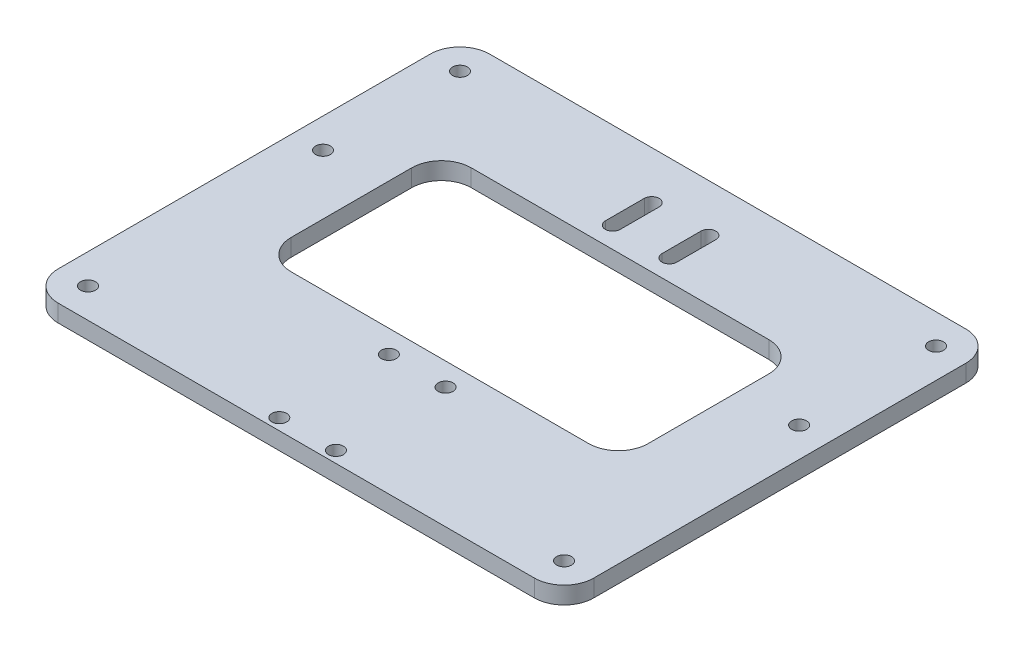
ISO-10303-21;
HEADER;
FILE_DESCRIPTION(('STEP AP214'),'2;1');
FILE_NAME('part.step','',(''),(''),'','','');
FILE_SCHEMA(('AUTOMOTIVE_DESIGN { 1 0 10303 214 1 1 1 1 }'));
ENDSEC;
DATA;
#1=APPLICATION_CONTEXT('core data for automotive mechanical design processes');
#2=APPLICATION_PROTOCOL_DEFINITION('international standard','automotive_design',2000,#1);
#3=PRODUCT_CONTEXT('',#1,'mechanical');
#4=PRODUCT('Part','Part','',(#3));
#5=PRODUCT_RELATED_PRODUCT_CATEGORY('part','',(#4));
#6=PRODUCT_DEFINITION_FORMATION('','',#4);
#7=PRODUCT_DEFINITION_CONTEXT('part definition',#1,'design');
#8=PRODUCT_DEFINITION('design','',#6,#7);
#9=PRODUCT_DEFINITION_SHAPE('','',#8);
#10=(LENGTH_UNIT() NAMED_UNIT(*) SI_UNIT(.MILLI.,.METRE.));
#11=(NAMED_UNIT(*) PLANE_ANGLE_UNIT() SI_UNIT($,.RADIAN.));
#12=(NAMED_UNIT(*) SI_UNIT($,.STERADIAN.) SOLID_ANGLE_UNIT());
#13=UNCERTAINTY_MEASURE_WITH_UNIT(LENGTH_MEASURE(1.E-05),#10,'distance_accuracy_value','');
#14=(GEOMETRIC_REPRESENTATION_CONTEXT(3) GLOBAL_UNCERTAINTY_ASSIGNED_CONTEXT((#13)) GLOBAL_UNIT_ASSIGNED_CONTEXT((#10,
#11,#12)) REPRESENTATION_CONTEXT('',''));
#15=CARTESIAN_POINT('',(0.,0.,0.));
#16=DIRECTION('',(0.,0.,1.));
#17=DIRECTION('',(1.,0.,0.));
#18=AXIS2_PLACEMENT_3D('',#15,#16,#17);
#19=CARTESIAN_POINT('',(90.,2.9,85.));
#20=DIRECTION('',(-1.,0.,0.));
#21=DIRECTION('',(0.,0.,1.));
#22=AXIS2_PLACEMENT_3D('',#19,#20,#21);
#23=PLANE('',#22);
#24=DIRECTION('',(0.,0.,-1.));
#25=VECTOR('',#24,1.);
#26=CARTESIAN_POINT('',(90.,2.9,85.));
#27=LINE('',#26,#25);
#28=CARTESIAN_POINT('',(90.,2.9,75.));
#29=VERTEX_POINT('',#28);
#30=CARTESIAN_POINT('',(90.,2.9,-50.));
#31=VERTEX_POINT('',#30);
#32=EDGE_CURVE('E299',#29,#31,#27,.T.);
#33=ORIENTED_EDGE('',*,*,#32,.F.);
#34=DIRECTION('',(0.,-1.,0.));
#35=VECTOR('',#34,1.);
#36=CARTESIAN_POINT('',(90.,2.9,75.));
#37=LINE('',#36,#35);
#38=CARTESIAN_POINT('',(90.,-2.9,75.));
#39=VERTEX_POINT('',#38);
#40=EDGE_CURVE('E331',#29,#39,#37,.T.);
#41=ORIENTED_EDGE('',*,*,#40,.T.);
#42=DIRECTION('',(0.,0.,-1.));
#43=VECTOR('',#42,1.);
#44=CARTESIAN_POINT('',(90.,-2.9,85.));
#45=LINE('',#44,#43);
#46=CARTESIAN_POINT('',(90.,-2.9,-50.));
#47=VERTEX_POINT('',#46);
#48=EDGE_CURVE('E288',#39,#47,#45,.T.);
#49=ORIENTED_EDGE('',*,*,#48,.T.);
#50=DIRECTION('',(0.,-1.,0.));
#51=VECTOR('',#50,1.);
#52=CARTESIAN_POINT('',(90.,2.9,-50.));
#53=LINE('',#52,#51);
#54=EDGE_CURVE('E329',#47,#31,#53,.F.);
#55=ORIENTED_EDGE('',*,*,#54,.T.);
#56=EDGE_LOOP('',(#33,#41,#49,#55));
#57=FACE_BOUND('',#56,.T.);
#58=ADVANCED_FACE('F32',(#57),#23,.F.);
#59=CARTESIAN_POINT('',(-90.,2.9,-60.));
#60=DIRECTION('',(0.,0.,1.));
#61=DIRECTION('',(1.,0.,0.));
#62=AXIS2_PLACEMENT_3D('',#59,#60,#61);
#63=PLANE('',#62);
#64=DIRECTION('',(-1.,0.,0.));
#65=VECTOR('',#64,1.);
#66=CARTESIAN_POINT('',(-90.,2.9,-60.));
#67=LINE('',#66,#65);
#68=CARTESIAN_POINT('',(79.9999999999999,2.9,-60.));
#69=VERTEX_POINT('',#68);
#70=CARTESIAN_POINT('',(-80.,2.9,-60.));
#71=VERTEX_POINT('',#70);
#72=EDGE_CURVE('E302',#69,#71,#67,.T.);
#73=ORIENTED_EDGE('',*,*,#72,.F.);
#74=DIRECTION('',(0.,-1.,0.));
#75=VECTOR('',#74,1.);
#76=CARTESIAN_POINT('',(80.,2.9,-60.));
#77=LINE('',#76,#75);
#78=CARTESIAN_POINT('',(79.9999999999999,-2.9,-60.));
#79=VERTEX_POINT('',#78);
#80=EDGE_CURVE('E360',#69,#79,#77,.T.);
#81=ORIENTED_EDGE('',*,*,#80,.T.);
#82=DIRECTION('',(-1.,0.,0.));
#83=VECTOR('',#82,1.);
#84=CARTESIAN_POINT('',(-90.,-2.9,-60.));
#85=LINE('',#84,#83);
#86=CARTESIAN_POINT('',(-80.,-2.9,-60.));
#87=VERTEX_POINT('',#86);
#88=EDGE_CURVE('E313',#79,#87,#85,.T.);
#89=ORIENTED_EDGE('',*,*,#88,.T.);
#90=DIRECTION('',(0.,-1.,0.));
#91=VECTOR('',#90,1.);
#92=CARTESIAN_POINT('',(-80.,2.9,-60.));
#93=LINE('',#92,#91);
#94=EDGE_CURVE('E358',#87,#71,#93,.F.);
#95=ORIENTED_EDGE('',*,*,#94,.T.);
#96=EDGE_LOOP('',(#73,#81,#89,#95));
#97=FACE_BOUND('',#96,.T.);
#98=ADVANCED_FACE('F434',(#97),#63,.F.);
#99=CARTESIAN_POINT('',(-90.,2.9,85.));
#100=DIRECTION('',(1.,0.,0.));
#101=DIRECTION('',(0.,0.,-1.));
#102=AXIS2_PLACEMENT_3D('',#99,#100,#101);
#103=PLANE('',#102);
#104=DIRECTION('',(0.,0.,1.));
#105=VECTOR('',#104,1.);
#106=CARTESIAN_POINT('',(-90.,-2.9,85.));
#107=LINE('',#106,#105);
#108=CARTESIAN_POINT('',(-90.,-2.9,-50.));
#109=VERTEX_POINT('',#108);
#110=CARTESIAN_POINT('',(-90.,-2.9,75.));
#111=VERTEX_POINT('',#110);
#112=EDGE_CURVE('E316',#109,#111,#107,.T.);
#113=ORIENTED_EDGE('',*,*,#112,.T.);
#114=DIRECTION('',(0.,-1.,0.));
#115=VECTOR('',#114,1.);
#116=CARTESIAN_POINT('',(-90.,2.9,75.));
#117=LINE('',#116,#115);
#118=CARTESIAN_POINT('',(-90.,2.9,75.));
#119=VERTEX_POINT('',#118);
#120=EDGE_CURVE('E47',#111,#119,#117,.F.);
#121=ORIENTED_EDGE('',*,*,#120,.T.);
#122=DIRECTION('',(0.,0.,1.));
#123=VECTOR('',#122,1.);
#124=CARTESIAN_POINT('',(-90.,2.9,85.));
#125=LINE('',#124,#123);
#126=CARTESIAN_POINT('',(-90.,2.9,-50.));
#127=VERTEX_POINT('',#126);
#128=EDGE_CURVE('E305',#127,#119,#125,.T.);
#129=ORIENTED_EDGE('',*,*,#128,.F.);
#130=DIRECTION('',(0.,-1.,0.));
#131=VECTOR('',#130,1.);
#132=CARTESIAN_POINT('',(-90.,2.9,-50.));
#133=LINE('',#132,#131);
#134=EDGE_CURVE('E354',#127,#109,#133,.T.);
#135=ORIENTED_EDGE('',*,*,#134,.T.);
#136=EDGE_LOOP('',(#113,#121,#129,#135));
#137=FACE_BOUND('',#136,.T.);
#138=ADVANCED_FACE('F440',(#137),#103,.F.);
#139=CARTESIAN_POINT('',(-90.,2.9,85.));
#140=DIRECTION('',(0.,0.,-1.));
#141=DIRECTION('',(-1.,0.,0.));
#142=AXIS2_PLACEMENT_3D('',#139,#140,#141);
#143=PLANE('',#142);
#144=DIRECTION('',(1.,0.,0.));
#145=VECTOR('',#144,1.);
#146=CARTESIAN_POINT('',(-90.,-2.9,85.));
#147=LINE('',#146,#145);
#148=CARTESIAN_POINT('',(-80.,-2.9,85.));
#149=VERTEX_POINT('',#148);
#150=CARTESIAN_POINT('',(79.9999999999999,-2.9,85.));
#151=VERTEX_POINT('',#150);
#152=EDGE_CURVE('E303',#149,#151,#147,.T.);
#153=ORIENTED_EDGE('',*,*,#152,.T.);
#154=DIRECTION('',(0.,-1.,0.));
#155=VECTOR('',#154,1.);
#156=CARTESIAN_POINT('',(80.,2.9,85.));
#157=LINE('',#156,#155);
#158=CARTESIAN_POINT('',(79.9999999999999,2.9,85.));
#159=VERTEX_POINT('',#158);
#160=EDGE_CURVE('E345',#151,#159,#157,.F.);
#161=ORIENTED_EDGE('',*,*,#160,.T.);
#162=DIRECTION('',(1.,0.,0.));
#163=VECTOR('',#162,1.);
#164=CARTESIAN_POINT('',(-90.,2.9,85.));
#165=LINE('',#164,#163);
#166=CARTESIAN_POINT('',(-80.,2.9,85.));
#167=VERTEX_POINT('',#166);
#168=EDGE_CURVE('E307',#167,#159,#165,.T.);
#169=ORIENTED_EDGE('',*,*,#168,.F.);
#170=DIRECTION('',(0.,-1.,0.));
#171=VECTOR('',#170,1.);
#172=CARTESIAN_POINT('',(-80.,2.9,85.));
#173=LINE('',#172,#171);
#174=EDGE_CURVE('E342',#167,#149,#173,.T.);
#175=ORIENTED_EDGE('',*,*,#174,.T.);
#176=EDGE_LOOP('',(#153,#161,#169,#175));
#177=FACE_BOUND('',#176,.T.);
#178=ADVANCED_FACE('F475',(#177),#143,.F.);
#179=CARTESIAN_POINT('',(0.,2.9,0.));
#180=DIRECTION('',(0.,-1.,0.));
#181=DIRECTION('',(0.,0.,-1.));
#182=AXIS2_PLACEMENT_3D('',#179,#180,#181);
#183=PLANE('',#182);
#184=CARTESIAN_POINT('',(-80.,2.9,-3.99826174005201));
#185=DIRECTION('',(0.,1.,0.));
#186=DIRECTION('',(0.,0.,1.));
#187=AXIS2_PLACEMENT_3D('',#184,#185,#186);
#188=CIRCLE('',#187,2.5);
#189=CARTESIAN_POINT('',(-80.,2.9,-1.49826174005201));
#190=VERTEX_POINT('',#189);
#191=EDGE_CURVE('E573',#190,#190,#188,.T.);
#192=ORIENTED_EDGE('',*,*,#191,.F.);
#193=EDGE_LOOP('',(#192));
#194=FACE_BOUND('',#193,.T.);
#195=CARTESIAN_POINT('',(-80.,2.9,75.));
#196=DIRECTION('',(0.,1.,0.));
#197=DIRECTION('',(0.,0.,1.));
#198=AXIS2_PLACEMENT_3D('',#195,#196,#197);
#199=CIRCLE('',#198,2.50000000000001);
#200=CARTESIAN_POINT('',(-80.,2.9,77.5));
#201=VERTEX_POINT('',#200);
#202=EDGE_CURVE('E579',#201,#201,#199,.T.);
#203=ORIENTED_EDGE('',*,*,#202,.F.);
#204=EDGE_LOOP('',(#203));
#205=FACE_BOUND('',#204,.T.);
#206=CARTESIAN_POINT('',(80.,2.9,75.));
#207=DIRECTION('',(0.,1.,0.));
#208=DIRECTION('',(0.,0.,1.));
#209=AXIS2_PLACEMENT_3D('',#206,#207,#208);
#210=CIRCLE('',#209,2.50000000000001);
#211=CARTESIAN_POINT('',(80.,2.9,77.5));
#212=VERTEX_POINT('',#211);
#213=EDGE_CURVE('E587',#212,#212,#210,.T.);
#214=ORIENTED_EDGE('',*,*,#213,.F.);
#215=EDGE_LOOP('',(#214));
#216=FACE_BOUND('',#215,.T.);
#217=CARTESIAN_POINT('',(80.,2.9,-3.99826174005201));
#218=DIRECTION('',(0.,1.,0.));
#219=DIRECTION('',(0.,0.,1.));
#220=AXIS2_PLACEMENT_3D('',#217,#218,#219);
#221=CIRCLE('',#220,2.5);
#222=CARTESIAN_POINT('',(80.,2.9,-1.49826174005201));
#223=VERTEX_POINT('',#222);
#224=EDGE_CURVE('E593',#223,#223,#221,.T.);
#225=ORIENTED_EDGE('',*,*,#224,.F.);
#226=EDGE_LOOP('',(#225));
#227=FACE_BOUND('',#226,.T.);
#228=CARTESIAN_POINT('',(80.,2.9,-50.));
#229=DIRECTION('',(0.,1.,0.));
#230=DIRECTION('',(0.,0.,1.));
#231=AXIS2_PLACEMENT_3D('',#228,#229,#230);
#232=CIRCLE('',#231,2.50000000000001);
#233=CARTESIAN_POINT('',(80.,2.9,-47.5));
#234=VERTEX_POINT('',#233);
#235=EDGE_CURVE('E599',#234,#234,#232,.T.);
#236=ORIENTED_EDGE('',*,*,#235,.F.);
#237=EDGE_LOOP('',(#236));
#238=FACE_BOUND('',#237,.T.);
#239=CARTESIAN_POINT('',(-80.,2.9,-50.));
#240=DIRECTION('',(0.,1.,0.));
#241=DIRECTION('',(0.,0.,1.));
#242=AXIS2_PLACEMENT_3D('',#239,#240,#241);
#243=CIRCLE('',#242,2.50000000000001);
#244=CARTESIAN_POINT('',(-80.,2.9,-47.5));
#245=VERTEX_POINT('',#244);
#246=EDGE_CURVE('E576',#245,#245,#243,.T.);
#247=ORIENTED_EDGE('',*,*,#246,.F.);
#248=EDGE_LOOP('',(#247));
#249=FACE_BOUND('',#248,.T.);
#250=CARTESIAN_POINT('',(9.52500000000001,2.9,81.1899999999994));
#251=DIRECTION('',(0.,1.,0.));
#252=DIRECTION('',(0.,0.,1.));
#253=AXIS2_PLACEMENT_3D('',#250,#251,#252);
#254=CIRCLE('',#253,2.5);
#255=CARTESIAN_POINT('',(9.52500000000001,2.9,83.6899999999994));
#256=VERTEX_POINT('',#255);
#257=EDGE_CURVE('E605',#256,#256,#254,.T.);
#258=ORIENTED_EDGE('',*,*,#257,.F.);
#259=EDGE_LOOP('',(#258));
#260=FACE_BOUND('',#259,.T.);
#261=CARTESIAN_POINT('',(-9.52500000000001,2.9,81.1899999999994));
#262=DIRECTION('',(0.,1.,0.));
#263=DIRECTION('',(0.,0.,1.));
#264=AXIS2_PLACEMENT_3D('',#261,#262,#263);
#265=CIRCLE('',#264,2.5);
#266=CARTESIAN_POINT('',(-9.52500000000001,2.9,83.6899999999994));
#267=VERTEX_POINT('',#266);
#268=EDGE_CURVE('E616',#267,#267,#265,.T.);
#269=ORIENTED_EDGE('',*,*,#268,.F.);
#270=EDGE_LOOP('',(#269));
#271=FACE_BOUND('',#270,.T.);
#272=CARTESIAN_POINT('',(9.52500000000001,2.9,44.3599999999994));
#273=DIRECTION('',(0.,1.,0.));
#274=DIRECTION('',(0.,0.,1.));
#275=AXIS2_PLACEMENT_3D('',#272,#273,#274);
#276=CIRCLE('',#275,2.5);
#277=CARTESIAN_POINT('',(9.52500000000001,2.9,46.8599999999994));
#278=VERTEX_POINT('',#277);
#279=EDGE_CURVE('E610',#278,#278,#276,.T.);
#280=ORIENTED_EDGE('',*,*,#279,.F.);
#281=EDGE_LOOP('',(#280));
#282=FACE_BOUND('',#281,.T.);
#283=DIRECTION('',(0.,0.,-1.));
#284=VECTOR('',#283,1.);
#285=CARTESIAN_POINT('',(12.025,2.9,-30.8896671829319));
#286=LINE('',#285,#284);
#287=CARTESIAN_POINT('',(12.025,2.9,-30.8896671829319));
#288=VERTEX_POINT('',#287);
#289=CARTESIAN_POINT('',(12.025,2.9,-43.9820988170681));
#290=VERTEX_POINT('',#289);
#291=EDGE_CURVE('E231',#288,#290,#286,.T.);
#292=ORIENTED_EDGE('',*,*,#291,.F.);
#293=CARTESIAN_POINT('',(9.52500000000001,2.9,-30.8896671829319));
#294=DIRECTION('',(0.,1.,0.));
#295=DIRECTION('',(0.,0.,1.));
#296=AXIS2_PLACEMENT_3D('',#293,#294,#295);
#297=CIRCLE('',#296,2.5);
#298=CARTESIAN_POINT('',(7.025,2.9,-30.8896671829319));
#299=VERTEX_POINT('',#298);
#300=EDGE_CURVE('E201',#299,#288,#297,.T.);
#301=ORIENTED_EDGE('',*,*,#300,.F.);
#302=DIRECTION('',(0.,0.,1.));
#303=VECTOR('',#302,1.);
#304=CARTESIAN_POINT('',(7.025,2.9,-30.8896671829319));
#305=LINE('',#304,#303);
#306=CARTESIAN_POINT('',(7.025,2.9,-43.9820988170681));
#307=VERTEX_POINT('',#306);
#308=EDGE_CURVE('E219',#307,#299,#305,.T.);
#309=ORIENTED_EDGE('',*,*,#308,.F.);
#310=CARTESIAN_POINT('',(9.52500000000001,2.9,-43.982098817068));
#311=DIRECTION('',(0.,1.,0.));
#312=DIRECTION('',(0.,0.,1.));
#313=AXIS2_PLACEMENT_3D('',#310,#311,#312);
#314=CIRCLE('',#313,2.5);
#315=EDGE_CURVE('E222',#290,#307,#314,.T.);
#316=ORIENTED_EDGE('',*,*,#315,.F.);
#317=EDGE_LOOP('',(#292,#301,#309,#316));
#318=FACE_BOUND('',#317,.T.);
#319=CARTESIAN_POINT('',(-9.52500000000001,2.9,44.3599999999994));
#320=DIRECTION('',(0.,1.,0.));
#321=DIRECTION('',(0.,0.,1.));
#322=AXIS2_PLACEMENT_3D('',#319,#320,#321);
#323=CIRCLE('',#322,2.5);
#324=CARTESIAN_POINT('',(-9.52500000000001,2.9,46.8599999999994));
#325=VERTEX_POINT('',#324);
#326=EDGE_CURVE('E225',#325,#325,#323,.T.);
#327=ORIENTED_EDGE('',*,*,#326,.F.);
#328=EDGE_LOOP('',(#327));
#329=FACE_BOUND('',#328,.T.);
#330=DIRECTION('',(0.,0.,-1.));
#331=VECTOR('',#330,1.);
#332=CARTESIAN_POINT('',(-7.025,2.9,-30.8896671829319));
#333=LINE('',#332,#331);
#334=CARTESIAN_POINT('',(-7.025,2.9,-30.8896671829319));
#335=VERTEX_POINT('',#334);
#336=CARTESIAN_POINT('',(-7.02500000000001,2.9,-43.9820988170681));
#337=VERTEX_POINT('',#336);
#338=EDGE_CURVE('E257',#335,#337,#333,.T.);
#339=ORIENTED_EDGE('',*,*,#338,.F.);
#340=CARTESIAN_POINT('',(-9.52500000000001,2.9,-30.8896671829319));
#341=DIRECTION('',(0.,1.,0.));
#342=DIRECTION('',(0.,0.,1.));
#343=AXIS2_PLACEMENT_3D('',#340,#341,#342);
#344=CIRCLE('',#343,2.5);
#345=CARTESIAN_POINT('',(-12.025,2.9,-30.8896671829319));
#346=VERTEX_POINT('',#345);
#347=EDGE_CURVE('E255',#346,#335,#344,.T.);
#348=ORIENTED_EDGE('',*,*,#347,.F.);
#349=DIRECTION('',(0.,0.,1.));
#350=VECTOR('',#349,1.);
#351=CARTESIAN_POINT('',(-12.025,2.9,-30.8896671829319));
#352=LINE('',#351,#350);
#353=CARTESIAN_POINT('',(-12.025,2.9,-43.9820988170681));
#354=VERTEX_POINT('',#353);
#355=EDGE_CURVE('E245',#354,#346,#352,.T.);
#356=ORIENTED_EDGE('',*,*,#355,.F.);
#357=CARTESIAN_POINT('',(-9.52500000000001,2.9,-43.982098817068));
#358=DIRECTION('',(0.,1.,0.));
#359=DIRECTION('',(0.,0.,1.));
#360=AXIS2_PLACEMENT_3D('',#357,#358,#359);
#361=CIRCLE('',#360,2.5);
#362=EDGE_CURVE('E261',#337,#354,#361,.T.);
#363=ORIENTED_EDGE('',*,*,#362,.F.);
#364=EDGE_LOOP('',(#339,#348,#356,#363));
#365=FACE_BOUND('',#364,.T.);
#366=DIRECTION('',(0.,0.,1.));
#367=VECTOR('',#366,1.);
#368=CARTESIAN_POINT('',(-60.,2.9,23.8));
#369=LINE('',#368,#367);
#370=CARTESIAN_POINT('',(-60.,2.9,-13.8));
#371=VERTEX_POINT('',#370);
#372=CARTESIAN_POINT('',(-60.,2.9,26.74));
#373=VERTEX_POINT('',#372);
#374=EDGE_CURVE('E268',#371,#373,#369,.T.);
#375=ORIENTED_EDGE('',*,*,#374,.F.);
#376=CARTESIAN_POINT('',(-50.,2.9,-13.8));
#377=DIRECTION('',(0.,-1.,0.));
#378=DIRECTION('',(0.,0.,-1.));
#379=AXIS2_PLACEMENT_3D('',#376,#377,#378);
#380=CIRCLE('',#379,10.);
#381=CARTESIAN_POINT('',(-50.,2.9,-23.8));
#382=VERTEX_POINT('',#381);
#383=EDGE_CURVE('E381',#371,#382,#380,.T.);
#384=ORIENTED_EDGE('',*,*,#383,.T.);
#385=DIRECTION('',(-1.,0.,0.));
#386=VECTOR('',#385,1.);
#387=CARTESIAN_POINT('',(-60.,2.9,-23.8));
#388=LINE('',#387,#386);
#389=CARTESIAN_POINT('',(50.,2.9,-23.8));
#390=VERTEX_POINT('',#389);
#391=EDGE_CURVE('E279',#390,#382,#388,.T.);
#392=ORIENTED_EDGE('',*,*,#391,.F.);
#393=CARTESIAN_POINT('',(50.,2.9,-13.8));
#394=DIRECTION('',(0.,-1.,0.));
#395=DIRECTION('',(0.,0.,-1.));
#396=AXIS2_PLACEMENT_3D('',#393,#394,#395);
#397=CIRCLE('',#396,10.);
#398=CARTESIAN_POINT('',(60.,2.9,-13.8));
#399=VERTEX_POINT('',#398);
#400=EDGE_CURVE('E40',#390,#399,#397,.T.);
#401=ORIENTED_EDGE('',*,*,#400,.T.);
#402=DIRECTION('',(0.,0.,-1.));
#403=VECTOR('',#402,1.);
#404=CARTESIAN_POINT('',(60.,2.9,-23.8));
#405=LINE('',#404,#403);
#406=CARTESIAN_POINT('',(60.,2.9,26.74));
#407=VERTEX_POINT('',#406);
#408=EDGE_CURVE('E294',#407,#399,#405,.T.);
#409=ORIENTED_EDGE('',*,*,#408,.F.);
#410=CARTESIAN_POINT('',(50.,2.9,26.74));
#411=DIRECTION('',(0.,-1.,0.));
#412=DIRECTION('',(0.,0.,-1.));
#413=AXIS2_PLACEMENT_3D('',#410,#411,#412);
#414=CIRCLE('',#413,10.);
#415=CARTESIAN_POINT('',(50.,2.9,36.74));
#416=VERTEX_POINT('',#415);
#417=EDGE_CURVE('E377',#407,#416,#414,.T.);
#418=ORIENTED_EDGE('',*,*,#417,.T.);
#419=DIRECTION('',(1.,0.,0.));
#420=VECTOR('',#419,1.);
#421=CARTESIAN_POINT('',(-60.,2.9,36.74));
#422=LINE('',#421,#420);
#423=CARTESIAN_POINT('',(-50.,2.9,36.74));
#424=VERTEX_POINT('',#423);
#425=EDGE_CURVE('E291',#424,#416,#422,.T.);
#426=ORIENTED_EDGE('',*,*,#425,.F.);
#427=CARTESIAN_POINT('',(-50.,2.9,26.74));
#428=DIRECTION('',(0.,-1.,0.));
#429=DIRECTION('',(0.,0.,-1.));
#430=AXIS2_PLACEMENT_3D('',#427,#428,#429);
#431=CIRCLE('',#430,10.);
#432=EDGE_CURVE('E373',#424,#373,#431,.T.);
#433=ORIENTED_EDGE('',*,*,#432,.T.);
#434=EDGE_LOOP('',(#375,#384,#392,#401,#409,#418,#426,#433));
#435=FACE_BOUND('',#434,.T.);
#436=ORIENTED_EDGE('',*,*,#168,.T.);
#437=CARTESIAN_POINT('',(80.,2.9,75.));
#438=DIRECTION('',(0.,-1.,0.));
#439=DIRECTION('',(0.,0.,-1.));
#440=AXIS2_PLACEMENT_3D('',#437,#438,#439);
#441=CIRCLE('',#440,10.);
#442=EDGE_CURVE('E352',#159,#29,#441,.F.);
#443=ORIENTED_EDGE('',*,*,#442,.T.);
#444=ORIENTED_EDGE('',*,*,#32,.T.);
#445=CARTESIAN_POINT('',(80.,2.9,-50.));
#446=DIRECTION('',(0.,-1.,0.));
#447=DIRECTION('',(0.,0.,-1.));
#448=AXIS2_PLACEMENT_3D('',#445,#446,#447);
#449=CIRCLE('',#448,10.);
#450=EDGE_CURVE('E348',#31,#69,#449,.F.);
#451=ORIENTED_EDGE('',*,*,#450,.T.);
#452=ORIENTED_EDGE('',*,*,#72,.T.);
#453=CARTESIAN_POINT('',(-80.,2.9,-50.));
#454=DIRECTION('',(0.,-1.,0.));
#455=DIRECTION('',(0.,0.,-1.));
#456=AXIS2_PLACEMENT_3D('',#453,#454,#455);
#457=CIRCLE('',#456,10.);
#458=EDGE_CURVE('E54',#71,#127,#457,.F.);
#459=ORIENTED_EDGE('',*,*,#458,.T.);
#460=ORIENTED_EDGE('',*,*,#128,.T.);
#461=CARTESIAN_POINT('',(-80.,2.9,75.));
#462=DIRECTION('',(0.,-1.,0.));
#463=DIRECTION('',(0.,0.,-1.));
#464=AXIS2_PLACEMENT_3D('',#461,#462,#463);
#465=CIRCLE('',#464,10.);
#466=EDGE_CURVE('E350',#119,#167,#465,.F.);
#467=ORIENTED_EDGE('',*,*,#466,.T.);
#468=EDGE_LOOP('',(#436,#443,#444,#451,#452,#459,#460,#467));
#469=FACE_BOUND('',#468,.T.);
#470=ADVANCED_FACE('F388',(#194,#205,#216,#227,#238,#249,#260,#271,#282,#318,#329,#365,#435,
#469),#183,.F.);
#471=CARTESIAN_POINT('',(0.,-2.9,0.));
#472=DIRECTION('',(0.,-1.,0.));
#473=DIRECTION('',(0.,0.,-1.));
#474=AXIS2_PLACEMENT_3D('',#471,#472,#473);
#475=PLANE('',#474);
#476=CARTESIAN_POINT('',(-80.,-2.9,-3.99826174005201));
#477=DIRECTION('',(0.,1.,0.));
#478=DIRECTION('',(0.,0.,1.));
#479=AXIS2_PLACEMENT_3D('',#476,#477,#478);
#480=CIRCLE('',#479,2.5);
#481=CARTESIAN_POINT('',(-80.,-2.9,-1.49826174005201));
#482=VERTEX_POINT('',#481);
#483=EDGE_CURVE('E570',#482,#482,#480,.T.);
#484=ORIENTED_EDGE('',*,*,#483,.T.);
#485=EDGE_LOOP('',(#484));
#486=FACE_BOUND('',#485,.T.);
#487=CARTESIAN_POINT('',(-80.,-2.9,75.));
#488=DIRECTION('',(0.,1.,0.));
#489=DIRECTION('',(0.,0.,1.));
#490=AXIS2_PLACEMENT_3D('',#487,#488,#489);
#491=CIRCLE('',#490,2.50000000000001);
#492=CARTESIAN_POINT('',(-80.,-2.9,77.5));
#493=VERTEX_POINT('',#492);
#494=EDGE_CURVE('E574',#493,#493,#491,.T.);
#495=ORIENTED_EDGE('',*,*,#494,.T.);
#496=EDGE_LOOP('',(#495));
#497=FACE_BOUND('',#496,.T.);
#498=CARTESIAN_POINT('',(80.,-2.9,75.));
#499=DIRECTION('',(0.,1.,0.));
#500=DIRECTION('',(0.,0.,1.));
#501=AXIS2_PLACEMENT_3D('',#498,#499,#500);
#502=CIRCLE('',#501,2.50000000000001);
#503=CARTESIAN_POINT('',(80.,-2.9,77.5));
#504=VERTEX_POINT('',#503);
#505=EDGE_CURVE('E584',#504,#504,#502,.T.);
#506=ORIENTED_EDGE('',*,*,#505,.T.);
#507=EDGE_LOOP('',(#506));
#508=FACE_BOUND('',#507,.T.);
#509=CARTESIAN_POINT('',(80.,-2.9,-3.99826174005201));
#510=DIRECTION('',(0.,1.,0.));
#511=DIRECTION('',(0.,0.,1.));
#512=AXIS2_PLACEMENT_3D('',#509,#510,#511);
#513=CIRCLE('',#512,2.5);
#514=CARTESIAN_POINT('',(80.,-2.9,-1.49826174005201));
#515=VERTEX_POINT('',#514);
#516=EDGE_CURVE('E590',#515,#515,#513,.T.);
#517=ORIENTED_EDGE('',*,*,#516,.T.);
#518=EDGE_LOOP('',(#517));
#519=FACE_BOUND('',#518,.T.);
#520=CARTESIAN_POINT('',(80.,-2.9,-50.));
#521=DIRECTION('',(0.,1.,0.));
#522=DIRECTION('',(0.,0.,1.));
#523=AXIS2_PLACEMENT_3D('',#520,#521,#522);
#524=CIRCLE('',#523,2.50000000000001);
#525=CARTESIAN_POINT('',(80.,-2.9,-47.5));
#526=VERTEX_POINT('',#525);
#527=EDGE_CURVE('E596',#526,#526,#524,.T.);
#528=ORIENTED_EDGE('',*,*,#527,.T.);
#529=EDGE_LOOP('',(#528));
#530=FACE_BOUND('',#529,.T.);
#531=CARTESIAN_POINT('',(-80.,-2.9,-50.));
#532=DIRECTION('',(0.,1.,0.));
#533=DIRECTION('',(0.,0.,1.));
#534=AXIS2_PLACEMENT_3D('',#531,#532,#533);
#535=CIRCLE('',#534,2.50000000000001);
#536=CARTESIAN_POINT('',(-80.,-2.9,-47.5));
#537=VERTEX_POINT('',#536);
#538=EDGE_CURVE('E602',#537,#537,#535,.T.);
#539=ORIENTED_EDGE('',*,*,#538,.T.);
#540=EDGE_LOOP('',(#539));
#541=FACE_BOUND('',#540,.T.);
#542=CARTESIAN_POINT('',(9.52500000000001,-2.9,81.1899999999994));
#543=DIRECTION('',(0.,1.,0.));
#544=DIRECTION('',(0.,0.,1.));
#545=AXIS2_PLACEMENT_3D('',#542,#543,#544);
#546=CIRCLE('',#545,2.5);
#547=CARTESIAN_POINT('',(9.52500000000001,-2.9,83.6899999999994));
#548=VERTEX_POINT('',#547);
#549=EDGE_CURVE('E619',#548,#548,#546,.T.);
#550=ORIENTED_EDGE('',*,*,#549,.T.);
#551=EDGE_LOOP('',(#550));
#552=FACE_BOUND('',#551,.T.);
#553=CARTESIAN_POINT('',(-9.52500000000001,-2.9,81.1899999999994));
#554=DIRECTION('',(0.,1.,0.));
#555=DIRECTION('',(0.,0.,1.));
#556=AXIS2_PLACEMENT_3D('',#553,#554,#555);
#557=CIRCLE('',#556,2.5);
#558=CARTESIAN_POINT('',(-9.52500000000001,-2.9,83.6899999999994));
#559=VERTEX_POINT('',#558);
#560=EDGE_CURVE('E613',#559,#559,#557,.T.);
#561=ORIENTED_EDGE('',*,*,#560,.T.);
#562=EDGE_LOOP('',(#561));
#563=FACE_BOUND('',#562,.T.);
#564=CARTESIAN_POINT('',(9.52500000000001,-2.9,44.3599999999994));
#565=DIRECTION('',(0.,1.,0.));
#566=DIRECTION('',(0.,0.,1.));
#567=AXIS2_PLACEMENT_3D('',#564,#565,#566);
#568=CIRCLE('',#567,2.5);
#569=CARTESIAN_POINT('',(9.52500000000001,-2.9,46.8599999999994));
#570=VERTEX_POINT('',#569);
#571=EDGE_CURVE('E232',#570,#570,#568,.T.);
#572=ORIENTED_EDGE('',*,*,#571,.T.);
#573=EDGE_LOOP('',(#572));
#574=FACE_BOUND('',#573,.T.);
#575=CARTESIAN_POINT('',(9.52500000000001,-2.9,-30.8896671829319));
#576=DIRECTION('',(0.,1.,0.));
#577=DIRECTION('',(0.,0.,1.));
#578=AXIS2_PLACEMENT_3D('',#575,#576,#577);
#579=CIRCLE('',#578,2.5);
#580=CARTESIAN_POINT('',(7.025,-2.9,-30.8896671829319));
#581=VERTEX_POINT('',#580);
#582=CARTESIAN_POINT('',(12.025,-2.9,-30.8896671829319));
#583=VERTEX_POINT('',#582);
#584=EDGE_CURVE('E198',#581,#583,#579,.T.);
#585=ORIENTED_EDGE('',*,*,#584,.T.);
#586=DIRECTION('',(0.,0.,-1.));
#587=VECTOR('',#586,1.);
#588=CARTESIAN_POINT('',(12.025,-2.9,-30.8896671829319));
#589=LINE('',#588,#587);
#590=CARTESIAN_POINT('',(12.025,-2.9,-43.9820988170681));
#591=VERTEX_POINT('',#590);
#592=EDGE_CURVE('E210',#583,#591,#589,.T.);
#593=ORIENTED_EDGE('',*,*,#592,.T.);
#594=CARTESIAN_POINT('',(9.52500000000001,-2.9,-43.982098817068));
#595=DIRECTION('',(0.,1.,0.));
#596=DIRECTION('',(0.,0.,1.));
#597=AXIS2_PLACEMENT_3D('',#594,#595,#596);
#598=CIRCLE('',#597,2.5);
#599=CARTESIAN_POINT('',(7.025,-2.9,-43.9820988170681));
#600=VERTEX_POINT('',#599);
#601=EDGE_CURVE('E214',#591,#600,#598,.T.);
#602=ORIENTED_EDGE('',*,*,#601,.T.);
#603=DIRECTION('',(0.,0.,1.));
#604=VECTOR('',#603,1.);
#605=CARTESIAN_POINT('',(7.025,-2.9,-30.8896671829319));
#606=LINE('',#605,#604);
#607=EDGE_CURVE('E206',#600,#581,#606,.T.);
#608=ORIENTED_EDGE('',*,*,#607,.T.);
#609=EDGE_LOOP('',(#585,#593,#602,#608));
#610=FACE_BOUND('',#609,.T.);
#611=CARTESIAN_POINT('',(-9.52500000000001,-2.9,44.3599999999994));
#612=DIRECTION('',(0.,1.,0.));
#613=DIRECTION('',(0.,0.,1.));
#614=AXIS2_PLACEMENT_3D('',#611,#612,#613);
#615=CIRCLE('',#614,2.5);
#616=CARTESIAN_POINT('',(-9.52500000000001,-2.9,46.8599999999994));
#617=VERTEX_POINT('',#616);
#618=EDGE_CURVE('E258',#617,#617,#615,.T.);
#619=ORIENTED_EDGE('',*,*,#618,.T.);
#620=EDGE_LOOP('',(#619));
#621=FACE_BOUND('',#620,.T.);
#622=CARTESIAN_POINT('',(-9.52500000000001,-2.9,-30.8896671829319));
#623=DIRECTION('',(0.,1.,0.));
#624=DIRECTION('',(0.,0.,1.));
#625=AXIS2_PLACEMENT_3D('',#622,#623,#624);
#626=CIRCLE('',#625,2.5);
#627=CARTESIAN_POINT('',(-12.025,-2.9,-30.8896671829319));
#628=VERTEX_POINT('',#627);
#629=CARTESIAN_POINT('',(-7.025,-2.9,-30.8896671829319));
#630=VERTEX_POINT('',#629);
#631=EDGE_CURVE('E241',#628,#630,#626,.T.);
#632=ORIENTED_EDGE('',*,*,#631,.T.);
#633=DIRECTION('',(0.,0.,-1.));
#634=VECTOR('',#633,1.);
#635=CARTESIAN_POINT('',(-7.025,-2.9,-30.8896671829319));
#636=LINE('',#635,#634);
#637=CARTESIAN_POINT('',(-7.025,-2.9,-43.9820988170681));
#638=VERTEX_POINT('',#637);
#639=EDGE_CURVE('E244',#630,#638,#636,.T.);
#640=ORIENTED_EDGE('',*,*,#639,.T.);
#641=CARTESIAN_POINT('',(-9.52500000000001,-2.9,-43.982098817068));
#642=DIRECTION('',(0.,1.,0.));
#643=DIRECTION('',(0.,0.,1.));
#644=AXIS2_PLACEMENT_3D('',#641,#642,#643);
#645=CIRCLE('',#644,2.5);
#646=CARTESIAN_POINT('',(-12.025,-2.9,-43.9820988170681));
#647=VERTEX_POINT('',#646);
#648=EDGE_CURVE('E248',#638,#647,#645,.T.);
#649=ORIENTED_EDGE('',*,*,#648,.T.);
#650=DIRECTION('',(0.,0.,1.));
#651=VECTOR('',#650,1.);
#652=CARTESIAN_POINT('',(-12.025,-2.9,-30.8896671829319));
#653=LINE('',#652,#651);
#654=EDGE_CURVE('E251',#647,#628,#653,.T.);
#655=ORIENTED_EDGE('',*,*,#654,.T.);
#656=EDGE_LOOP('',(#632,#640,#649,#655));
#657=FACE_BOUND('',#656,.T.);
#658=DIRECTION('',(0.,0.,-1.));
#659=VECTOR('',#658,1.);
#660=CARTESIAN_POINT('',(60.,-2.9,23.8));
#661=LINE('',#660,#659);
#662=CARTESIAN_POINT('',(60.,-2.9,26.74));
#663=VERTEX_POINT('',#662);
#664=CARTESIAN_POINT('',(60.,-2.9,-13.8));
#665=VERTEX_POINT('',#664);
#666=EDGE_CURVE('E282',#663,#665,#661,.T.);
#667=ORIENTED_EDGE('',*,*,#666,.T.);
#668=CARTESIAN_POINT('',(50.,-2.9,-13.8));
#669=DIRECTION('',(0.,-1.,0.));
#670=DIRECTION('',(0.,0.,-1.));
#671=AXIS2_PLACEMENT_3D('',#668,#669,#670);
#672=CIRCLE('',#671,10.);
#673=CARTESIAN_POINT('',(50.,-2.9,-23.8));
#674=VERTEX_POINT('',#673);
#675=EDGE_CURVE('E11',#665,#674,#672,.F.);
#676=ORIENTED_EDGE('',*,*,#675,.T.);
#677=DIRECTION('',(-1.,0.,0.));
#678=VECTOR('',#677,1.);
#679=CARTESIAN_POINT('',(-60.,-2.9,-23.8));
#680=LINE('',#679,#678);
#681=CARTESIAN_POINT('',(-50.,-2.9,-23.8));
#682=VERTEX_POINT('',#681);
#683=EDGE_CURVE('E285',#674,#682,#680,.T.);
#684=ORIENTED_EDGE('',*,*,#683,.T.);
#685=CARTESIAN_POINT('',(-50.,-2.9,-13.8));
#686=DIRECTION('',(0.,-1.,0.));
#687=DIRECTION('',(0.,0.,-1.));
#688=AXIS2_PLACEMENT_3D('',#685,#686,#687);
#689=CIRCLE('',#688,10.);
#690=CARTESIAN_POINT('',(-60.,-2.9,-13.8));
#691=VERTEX_POINT('',#690);
#692=EDGE_CURVE('E383',#682,#691,#689,.F.);
#693=ORIENTED_EDGE('',*,*,#692,.T.);
#694=DIRECTION('',(0.,0.,1.));
#695=VECTOR('',#694,1.);
#696=CARTESIAN_POINT('',(-60.,-2.9,-23.8));
#697=LINE('',#696,#695);
#698=CARTESIAN_POINT('',(-60.,-2.9,26.74));
#699=VERTEX_POINT('',#698);
#700=EDGE_CURVE('E275',#691,#699,#697,.T.);
#701=ORIENTED_EDGE('',*,*,#700,.T.);
#702=CARTESIAN_POINT('',(-50.,-2.9,26.74));
#703=DIRECTION('',(0.,-1.,0.));
#704=DIRECTION('',(0.,0.,-1.));
#705=AXIS2_PLACEMENT_3D('',#702,#703,#704);
#706=CIRCLE('',#705,10.);
#707=CARTESIAN_POINT('',(-50.,-2.9,36.74));
#708=VERTEX_POINT('',#707);
#709=EDGE_CURVE('E375',#699,#708,#706,.F.);
#710=ORIENTED_EDGE('',*,*,#709,.T.);
#711=DIRECTION('',(1.,0.,0.));
#712=VECTOR('',#711,1.);
#713=CARTESIAN_POINT('',(-60.,-2.9,36.74));
#714=LINE('',#713,#712);
#715=CARTESIAN_POINT('',(50.,-2.9,36.74));
#716=VERTEX_POINT('',#715);
#717=EDGE_CURVE('E278',#708,#716,#714,.T.);
#718=ORIENTED_EDGE('',*,*,#717,.T.);
#719=CARTESIAN_POINT('',(50.,-2.9,26.74));
#720=DIRECTION('',(0.,-1.,0.));
#721=DIRECTION('',(0.,0.,-1.));
#722=AXIS2_PLACEMENT_3D('',#719,#720,#721);
#723=CIRCLE('',#722,10.);
#724=EDGE_CURVE('E379',#716,#663,#723,.F.);
#725=ORIENTED_EDGE('',*,*,#724,.T.);
#726=EDGE_LOOP('',(#667,#676,#684,#693,#701,#710,#718,#725));
#727=FACE_BOUND('',#726,.T.);
#728=ORIENTED_EDGE('',*,*,#48,.F.);
#729=CARTESIAN_POINT('',(80.,-2.9,75.));
#730=DIRECTION('',(0.,-1.,0.));
#731=DIRECTION('',(0.,0.,-1.));
#732=AXIS2_PLACEMENT_3D('',#729,#730,#731);
#733=CIRCLE('',#732,10.);
#734=EDGE_CURVE('E340',#39,#151,#733,.T.);
#735=ORIENTED_EDGE('',*,*,#734,.T.);
#736=ORIENTED_EDGE('',*,*,#152,.F.);
#737=CARTESIAN_POINT('',(-80.,-2.9,75.));
#738=DIRECTION('',(0.,-1.,0.));
#739=DIRECTION('',(0.,0.,-1.));
#740=AXIS2_PLACEMENT_3D('',#737,#738,#739);
#741=CIRCLE('',#740,10.);
#742=EDGE_CURVE('E338',#149,#111,#741,.T.);
#743=ORIENTED_EDGE('',*,*,#742,.T.);
#744=ORIENTED_EDGE('',*,*,#112,.F.);
#745=CARTESIAN_POINT('',(-80.,-2.9,-50.));
#746=DIRECTION('',(0.,-1.,0.));
#747=DIRECTION('',(0.,0.,-1.));
#748=AXIS2_PLACEMENT_3D('',#745,#746,#747);
#749=CIRCLE('',#748,10.);
#750=EDGE_CURVE('E334',#109,#87,#749,.T.);
#751=ORIENTED_EDGE('',*,*,#750,.T.);
#752=ORIENTED_EDGE('',*,*,#88,.F.);
#753=CARTESIAN_POINT('',(80.,-2.9,-50.));
#754=DIRECTION('',(0.,-1.,0.));
#755=DIRECTION('',(0.,0.,-1.));
#756=AXIS2_PLACEMENT_3D('',#753,#754,#755);
#757=CIRCLE('',#756,10.);
#758=EDGE_CURVE('E336',#79,#47,#757,.T.);
#759=ORIENTED_EDGE('',*,*,#758,.T.);
#760=EDGE_LOOP('',(#728,#735,#736,#743,#744,#751,#752,#759));
#761=FACE_BOUND('',#760,.T.);
#762=ADVANCED_FACE('F216',(#486,#497,#508,#519,#530,#541,#552,#563,#574,#610,#621,#657,#727,
#761),#475,.T.);
#763=CARTESIAN_POINT('',(-60.,-2.9,-23.8));
#764=DIRECTION('',(0.,0.,-1.));
#765=DIRECTION('',(-1.,0.,0.));
#766=AXIS2_PLACEMENT_3D('',#763,#764,#765);
#767=PLANE('',#766);
#768=ORIENTED_EDGE('',*,*,#391,.T.);
#769=DIRECTION('',(0.,1.,0.));
#770=VECTOR('',#769,1.);
#771=CARTESIAN_POINT('',(-50.,-2.9,-23.8));
#772=LINE('',#771,#770);
#773=EDGE_CURVE('E371',#382,#682,#772,.F.);
#774=ORIENTED_EDGE('',*,*,#773,.T.);
#775=ORIENTED_EDGE('',*,*,#683,.F.);
#776=DIRECTION('',(0.,1.,0.));
#777=VECTOR('',#776,1.);
#778=CARTESIAN_POINT('',(50.,2.9,-23.8));
#779=LINE('',#778,#777);
#780=EDGE_CURVE('E368',#674,#390,#779,.T.);
#781=ORIENTED_EDGE('',*,*,#780,.T.);
#782=EDGE_LOOP('',(#768,#774,#775,#781));
#783=FACE_BOUND('',#782,.T.);
#784=ADVANCED_FACE('F402',(#783),#767,.F.);
#785=CARTESIAN_POINT('',(60.,-2.9,-23.8));
#786=DIRECTION('',(1.,0.,0.));
#787=DIRECTION('',(0.,0.,-1.));
#788=AXIS2_PLACEMENT_3D('',#785,#786,#787);
#789=PLANE('',#788);
#790=ORIENTED_EDGE('',*,*,#666,.F.);
#791=DIRECTION('',(0.,1.,0.));
#792=VECTOR('',#791,1.);
#793=CARTESIAN_POINT('',(60.,2.9,26.74));
#794=LINE('',#793,#792);
#795=EDGE_CURVE('E365',#663,#407,#794,.T.);
#796=ORIENTED_EDGE('',*,*,#795,.T.);
#797=ORIENTED_EDGE('',*,*,#408,.T.);
#798=DIRECTION('',(0.,1.,0.));
#799=VECTOR('',#798,1.);
#800=CARTESIAN_POINT('',(60.,-2.9,-13.8));
#801=LINE('',#800,#799);
#802=EDGE_CURVE('E363',#399,#665,#801,.F.);
#803=ORIENTED_EDGE('',*,*,#802,.T.);
#804=EDGE_LOOP('',(#790,#796,#797,#803));
#805=FACE_BOUND('',#804,.T.);
#806=ADVANCED_FACE('F394',(#805),#789,.F.);
#807=CARTESIAN_POINT('',(-60.,-2.9,36.74));
#808=DIRECTION('',(0.,0.,1.));
#809=DIRECTION('',(1.,0.,0.));
#810=AXIS2_PLACEMENT_3D('',#807,#808,#809);
#811=PLANE('',#810);
#812=ORIENTED_EDGE('',*,*,#717,.F.);
#813=DIRECTION('',(0.,1.,0.));
#814=VECTOR('',#813,1.);
#815=CARTESIAN_POINT('',(-50.,2.9,36.74));
#816=LINE('',#815,#814);
#817=EDGE_CURVE('E321',#708,#424,#816,.T.);
#818=ORIENTED_EDGE('',*,*,#817,.T.);
#819=ORIENTED_EDGE('',*,*,#425,.T.);
#820=DIRECTION('',(0.,1.,0.));
#821=VECTOR('',#820,1.);
#822=CARTESIAN_POINT('',(50.,-2.9,36.74));
#823=LINE('',#822,#821);
#824=EDGE_CURVE('E310',#416,#716,#823,.F.);
#825=ORIENTED_EDGE('',*,*,#824,.T.);
#826=EDGE_LOOP('',(#812,#818,#819,#825));
#827=FACE_BOUND('',#826,.T.);
#828=ADVANCED_FACE('F418',(#827),#811,.F.);
#829=CARTESIAN_POINT('',(-60.,-2.9,23.8));
#830=DIRECTION('',(-1.,0.,0.));
#831=DIRECTION('',(0.,0.,1.));
#832=AXIS2_PLACEMENT_3D('',#829,#830,#831);
#833=PLANE('',#832);
#834=ORIENTED_EDGE('',*,*,#374,.T.);
#835=DIRECTION('',(0.,1.,0.));
#836=VECTOR('',#835,1.);
#837=CARTESIAN_POINT('',(-60.,-2.9,26.74));
#838=LINE('',#837,#836);
#839=EDGE_CURVE('E327',#373,#699,#838,.F.);
#840=ORIENTED_EDGE('',*,*,#839,.T.);
#841=ORIENTED_EDGE('',*,*,#700,.F.);
#842=DIRECTION('',(0.,1.,0.));
#843=VECTOR('',#842,1.);
#844=CARTESIAN_POINT('',(-60.,2.9,-13.8));
#845=LINE('',#844,#843);
#846=EDGE_CURVE('E324',#691,#371,#845,.T.);
#847=ORIENTED_EDGE('',*,*,#846,.T.);
#848=EDGE_LOOP('',(#834,#840,#841,#847));
#849=FACE_BOUND('',#848,.T.);
#850=ADVANCED_FACE('F410',(#849),#833,.F.);
#851=CARTESIAN_POINT('',(-9.52500000000001,-2.9,-30.8896671829319));
#852=DIRECTION('',(0.,1.,0.));
#853=DIRECTION('',(0.,0.,1.));
#854=AXIS2_PLACEMENT_3D('',#851,#852,#853);
#855=CYLINDRICAL_SURFACE('',#854,2.5);
#856=ORIENTED_EDGE('',*,*,#347,.T.);
#857=DIRECTION('',(0.,1.,0.));
#858=VECTOR('',#857,1.);
#859=CARTESIAN_POINT('',(-7.025,-2.9,-30.8896671829319));
#860=LINE('',#859,#858);
#861=EDGE_CURVE('E254',#630,#335,#860,.T.);
#862=ORIENTED_EDGE('',*,*,#861,.F.);
#863=ORIENTED_EDGE('',*,*,#631,.F.);
#864=DIRECTION('',(0.,1.,0.));
#865=VECTOR('',#864,1.);
#866=CARTESIAN_POINT('',(-12.025,-2.9,-30.8896671829319));
#867=LINE('',#866,#865);
#868=EDGE_CURVE('E266',#628,#346,#867,.T.);
#869=ORIENTED_EDGE('',*,*,#868,.T.);
#870=EDGE_LOOP('',(#856,#862,#863,#869));
#871=FACE_BOUND('',#870,.T.);
#872=ADVANCED_FACE('F493',(#871),#855,.F.);
#873=CARTESIAN_POINT('',(-12.025,-2.9,-30.8896671829319));
#874=DIRECTION('',(-1.,0.,0.));
#875=DIRECTION('',(0.,0.,1.));
#876=AXIS2_PLACEMENT_3D('',#873,#874,#875);
#877=PLANE('',#876);
#878=ORIENTED_EDGE('',*,*,#355,.T.);
#879=ORIENTED_EDGE('',*,*,#868,.F.);
#880=ORIENTED_EDGE('',*,*,#654,.F.);
#881=DIRECTION('',(0.,1.,0.));
#882=VECTOR('',#881,1.);
#883=CARTESIAN_POINT('',(-12.025,-2.9,-43.9820988170681));
#884=LINE('',#883,#882);
#885=EDGE_CURVE('E269',#647,#354,#884,.T.);
#886=ORIENTED_EDGE('',*,*,#885,.T.);
#887=EDGE_LOOP('',(#878,#879,#880,#886));
#888=FACE_BOUND('',#887,.T.);
#889=ADVANCED_FACE('F502',(#888),#877,.F.);
#890=CARTESIAN_POINT('',(-9.52500000000001,-2.9,-43.982098817068));
#891=DIRECTION('',(0.,1.,0.));
#892=DIRECTION('',(0.,0.,1.));
#893=AXIS2_PLACEMENT_3D('',#890,#891,#892);
#894=CYLINDRICAL_SURFACE('',#893,2.5);
#895=ORIENTED_EDGE('',*,*,#362,.T.);
#896=ORIENTED_EDGE('',*,*,#885,.F.);
#897=ORIENTED_EDGE('',*,*,#648,.F.);
#898=DIRECTION('',(0.,1.,0.));
#899=VECTOR('',#898,1.);
#900=CARTESIAN_POINT('',(-7.02500000000001,-2.9,-43.9820988170681));
#901=LINE('',#900,#899);
#902=EDGE_CURVE('E271',#638,#337,#901,.T.);
#903=ORIENTED_EDGE('',*,*,#902,.T.);
#904=EDGE_LOOP('',(#895,#896,#897,#903));
#905=FACE_BOUND('',#904,.T.);
#906=ADVANCED_FACE('F508',(#905),#894,.F.);
#907=CARTESIAN_POINT('',(-7.025,-2.9,-30.8896671829319));
#908=DIRECTION('',(1.,0.,0.));
#909=DIRECTION('',(0.,0.,-1.));
#910=AXIS2_PLACEMENT_3D('',#907,#908,#909);
#911=PLANE('',#910);
#912=ORIENTED_EDGE('',*,*,#338,.T.);
#913=ORIENTED_EDGE('',*,*,#902,.F.);
#914=ORIENTED_EDGE('',*,*,#639,.F.);
#915=ORIENTED_EDGE('',*,*,#861,.T.);
#916=EDGE_LOOP('',(#912,#913,#914,#915));
#917=FACE_BOUND('',#916,.T.);
#918=ADVANCED_FACE('F504',(#917),#911,.F.);
#919=CARTESIAN_POINT('',(-9.52500000000001,-2.9,44.3599999999994));
#920=DIRECTION('',(0.,1.,0.));
#921=DIRECTION('',(0.,0.,1.));
#922=AXIS2_PLACEMENT_3D('',#919,#920,#921);
#923=CYLINDRICAL_SURFACE('',#922,2.5);
#924=ORIENTED_EDGE('',*,*,#618,.F.);
#925=EDGE_LOOP('',(#924));
#926=FACE_BOUND('',#925,.T.);
#927=ORIENTED_EDGE('',*,*,#326,.T.);
#928=EDGE_LOOP('',(#927));
#929=FACE_BOUND('',#928,.T.);
#930=ADVANCED_FACE('F507',(#926,#929),#923,.F.);
#931=CARTESIAN_POINT('',(9.52500000000001,-2.9,-30.8896671829319));
#932=DIRECTION('',(0.,1.,0.));
#933=DIRECTION('',(0.,0.,1.));
#934=AXIS2_PLACEMENT_3D('',#931,#932,#933);
#935=CYLINDRICAL_SURFACE('',#934,2.5);
#936=ORIENTED_EDGE('',*,*,#300,.T.);
#937=DIRECTION('',(0.,1.,0.));
#938=VECTOR('',#937,1.);
#939=CARTESIAN_POINT('',(12.025,-2.9,-30.8896671829319));
#940=LINE('',#939,#938);
#941=EDGE_CURVE('E194',#583,#288,#940,.T.);
#942=ORIENTED_EDGE('',*,*,#941,.F.);
#943=ORIENTED_EDGE('',*,*,#584,.F.);
#944=DIRECTION('',(0.,1.,0.));
#945=VECTOR('',#944,1.);
#946=CARTESIAN_POINT('',(7.025,-2.9,-30.8896671829319));
#947=LINE('',#946,#945);
#948=EDGE_CURVE('E236',#581,#299,#947,.T.);
#949=ORIENTED_EDGE('',*,*,#948,.T.);
#950=EDGE_LOOP('',(#936,#942,#943,#949));
#951=FACE_BOUND('',#950,.T.);
#952=ADVANCED_FACE('F196',(#951),#935,.F.);
#953=CARTESIAN_POINT('',(7.025,-2.9,-30.8896671829319));
#954=DIRECTION('',(-1.,0.,0.));
#955=DIRECTION('',(0.,0.,1.));
#956=AXIS2_PLACEMENT_3D('',#953,#954,#955);
#957=PLANE('',#956);
#958=ORIENTED_EDGE('',*,*,#308,.T.);
#959=ORIENTED_EDGE('',*,*,#948,.F.);
#960=ORIENTED_EDGE('',*,*,#607,.F.);
#961=DIRECTION('',(0.,1.,0.));
#962=VECTOR('',#961,1.);
#963=CARTESIAN_POINT('',(7.025,-2.9,-43.9820988170681));
#964=LINE('',#963,#962);
#965=EDGE_CURVE('E238',#600,#307,#964,.T.);
#966=ORIENTED_EDGE('',*,*,#965,.T.);
#967=EDGE_LOOP('',(#958,#959,#960,#966));
#968=FACE_BOUND('',#967,.T.);
#969=ADVANCED_FACE('F518',(#968),#957,.F.);
#970=CARTESIAN_POINT('',(9.52500000000001,-2.9,-43.982098817068));
#971=DIRECTION('',(0.,1.,0.));
#972=DIRECTION('',(0.,0.,1.));
#973=AXIS2_PLACEMENT_3D('',#970,#971,#972);
#974=CYLINDRICAL_SURFACE('',#973,2.5);
#975=ORIENTED_EDGE('',*,*,#315,.T.);
#976=ORIENTED_EDGE('',*,*,#965,.F.);
#977=ORIENTED_EDGE('',*,*,#601,.F.);
#978=DIRECTION('',(0.,1.,0.));
#979=VECTOR('',#978,1.);
#980=CARTESIAN_POINT('',(12.025,-2.9,-43.9820988170681));
#981=LINE('',#980,#979);
#982=EDGE_CURVE('E205',#591,#290,#981,.T.);
#983=ORIENTED_EDGE('',*,*,#982,.T.);
#984=EDGE_LOOP('',(#975,#976,#977,#983));
#985=FACE_BOUND('',#984,.T.);
#986=ADVANCED_FACE('F522',(#985),#974,.F.);
#987=CARTESIAN_POINT('',(12.025,-2.9,-30.8896671829319));
#988=DIRECTION('',(1.,0.,0.));
#989=DIRECTION('',(0.,0.,-1.));
#990=AXIS2_PLACEMENT_3D('',#987,#988,#989);
#991=PLANE('',#990);
#992=ORIENTED_EDGE('',*,*,#291,.T.);
#993=ORIENTED_EDGE('',*,*,#982,.F.);
#994=ORIENTED_EDGE('',*,*,#592,.F.);
#995=ORIENTED_EDGE('',*,*,#941,.T.);
#996=EDGE_LOOP('',(#992,#993,#994,#995));
#997=FACE_BOUND('',#996,.T.);
#998=ADVANCED_FACE('F211',(#997),#991,.F.);
#999=CARTESIAN_POINT('',(9.52500000000001,-2.9,44.3599999999994));
#1000=DIRECTION('',(0.,1.,0.));
#1001=DIRECTION('',(0.,0.,1.));
#1002=AXIS2_PLACEMENT_3D('',#999,#1000,#1001);
#1003=CYLINDRICAL_SURFACE('',#1002,2.5);
#1004=ORIENTED_EDGE('',*,*,#571,.F.);
#1005=EDGE_LOOP('',(#1004));
#1006=FACE_BOUND('',#1005,.T.);
#1007=ORIENTED_EDGE('',*,*,#279,.T.);
#1008=EDGE_LOOP('',(#1007));
#1009=FACE_BOUND('',#1008,.T.);
#1010=ADVANCED_FACE('F521',(#1006,#1009),#1003,.F.);
#1011=CARTESIAN_POINT('',(-9.52500000000001,-2.9,81.1899999999994));
#1012=DIRECTION('',(0.,1.,0.));
#1013=DIRECTION('',(0.,0.,1.));
#1014=AXIS2_PLACEMENT_3D('',#1011,#1012,#1013);
#1015=CYLINDRICAL_SURFACE('',#1014,2.5);
#1016=ORIENTED_EDGE('',*,*,#560,.F.);
#1017=EDGE_LOOP('',(#1016));
#1018=FACE_BOUND('',#1017,.T.);
#1019=ORIENTED_EDGE('',*,*,#268,.T.);
#1020=EDGE_LOOP('',(#1019));
#1021=FACE_BOUND('',#1020,.T.);
#1022=ADVANCED_FACE('F536',(#1018,#1021),#1015,.F.);
#1023=CARTESIAN_POINT('',(9.52500000000001,-2.9,81.1899999999994));
#1024=DIRECTION('',(0.,1.,0.));
#1025=DIRECTION('',(0.,0.,1.));
#1026=AXIS2_PLACEMENT_3D('',#1023,#1024,#1025);
#1027=CYLINDRICAL_SURFACE('',#1026,2.5);
#1028=ORIENTED_EDGE('',*,*,#549,.F.);
#1029=EDGE_LOOP('',(#1028));
#1030=FACE_BOUND('',#1029,.T.);
#1031=ORIENTED_EDGE('',*,*,#257,.T.);
#1032=EDGE_LOOP('',(#1031));
#1033=FACE_BOUND('',#1032,.T.);
#1034=ADVANCED_FACE('F532',(#1030,#1033),#1027,.F.);
#1035=CARTESIAN_POINT('',(-80.,-2.9,-50.));
#1036=DIRECTION('',(0.,1.,0.));
#1037=DIRECTION('',(0.,0.,1.));
#1038=AXIS2_PLACEMENT_3D('',#1035,#1036,#1037);
#1039=CYLINDRICAL_SURFACE('',#1038,2.50000000000001);
#1040=ORIENTED_EDGE('',*,*,#538,.F.);
#1041=EDGE_LOOP('',(#1040));
#1042=FACE_BOUND('',#1041,.T.);
#1043=ORIENTED_EDGE('',*,*,#246,.T.);
#1044=EDGE_LOOP('',(#1043));
#1045=FACE_BOUND('',#1044,.T.);
#1046=ADVANCED_FACE('F535',(#1042,#1045),#1039,.F.);
#1047=CARTESIAN_POINT('',(80.,-2.9,-50.));
#1048=DIRECTION('',(0.,1.,0.));
#1049=DIRECTION('',(0.,0.,1.));
#1050=AXIS2_PLACEMENT_3D('',#1047,#1048,#1049);
#1051=CYLINDRICAL_SURFACE('',#1050,2.50000000000001);
#1052=ORIENTED_EDGE('',*,*,#527,.F.);
#1053=EDGE_LOOP('',(#1052));
#1054=FACE_BOUND('',#1053,.T.);
#1055=ORIENTED_EDGE('',*,*,#235,.T.);
#1056=EDGE_LOOP('',(#1055));
#1057=FACE_BOUND('',#1056,.T.);
#1058=ADVANCED_FACE('F546',(#1054,#1057),#1051,.F.);
#1059=CARTESIAN_POINT('',(80.,-2.9,-3.99826174005201));
#1060=DIRECTION('',(0.,1.,0.));
#1061=DIRECTION('',(0.,0.,1.));
#1062=AXIS2_PLACEMENT_3D('',#1059,#1060,#1061);
#1063=CYLINDRICAL_SURFACE('',#1062,2.5);
#1064=ORIENTED_EDGE('',*,*,#516,.F.);
#1065=EDGE_LOOP('',(#1064));
#1066=FACE_BOUND('',#1065,.T.);
#1067=ORIENTED_EDGE('',*,*,#224,.T.);
#1068=EDGE_LOOP('',(#1067));
#1069=FACE_BOUND('',#1068,.T.);
#1070=ADVANCED_FACE('F550',(#1066,#1069),#1063,.F.);
#1071=CARTESIAN_POINT('',(80.,-2.9,75.));
#1072=DIRECTION('',(0.,1.,0.));
#1073=DIRECTION('',(0.,0.,1.));
#1074=AXIS2_PLACEMENT_3D('',#1071,#1072,#1073);
#1075=CYLINDRICAL_SURFACE('',#1074,2.50000000000001);
#1076=ORIENTED_EDGE('',*,*,#505,.F.);
#1077=EDGE_LOOP('',(#1076));
#1078=FACE_BOUND('',#1077,.T.);
#1079=ORIENTED_EDGE('',*,*,#213,.T.);
#1080=EDGE_LOOP('',(#1079));
#1081=FACE_BOUND('',#1080,.T.);
#1082=ADVANCED_FACE('F554',(#1078,#1081),#1075,.F.);
#1083=CARTESIAN_POINT('',(-80.,-2.9,75.));
#1084=DIRECTION('',(0.,1.,0.));
#1085=DIRECTION('',(0.,0.,1.));
#1086=AXIS2_PLACEMENT_3D('',#1083,#1084,#1085);
#1087=CYLINDRICAL_SURFACE('',#1086,2.50000000000001);
#1088=ORIENTED_EDGE('',*,*,#494,.F.);
#1089=EDGE_LOOP('',(#1088));
#1090=FACE_BOUND('',#1089,.T.);
#1091=ORIENTED_EDGE('',*,*,#202,.T.);
#1092=EDGE_LOOP('',(#1091));
#1093=FACE_BOUND('',#1092,.T.);
#1094=ADVANCED_FACE('F558',(#1090,#1093),#1087,.F.);
#1095=CARTESIAN_POINT('',(-80.,-2.9,-3.99826174005201));
#1096=DIRECTION('',(0.,1.,0.));
#1097=DIRECTION('',(0.,0.,1.));
#1098=AXIS2_PLACEMENT_3D('',#1095,#1096,#1097);
#1099=CYLINDRICAL_SURFACE('',#1098,2.5);
#1100=ORIENTED_EDGE('',*,*,#483,.F.);
#1101=EDGE_LOOP('',(#1100));
#1102=FACE_BOUND('',#1101,.T.);
#1103=ORIENTED_EDGE('',*,*,#191,.T.);
#1104=EDGE_LOOP('',(#1103));
#1105=FACE_BOUND('',#1104,.T.);
#1106=ADVANCED_FACE('F449',(#1102,#1105),#1099,.F.);
#1107=CARTESIAN_POINT('',(-50.,-2.9,26.74));
#1108=DIRECTION('',(0.,-1.,0.));
#1109=DIRECTION('',(0.,0.,-1.));
#1110=AXIS2_PLACEMENT_3D('',#1107,#1108,#1109);
#1111=CYLINDRICAL_SURFACE('',#1110,10.);
#1112=ORIENTED_EDGE('',*,*,#709,.F.);
#1113=ORIENTED_EDGE('',*,*,#839,.F.);
#1114=ORIENTED_EDGE('',*,*,#432,.F.);
#1115=ORIENTED_EDGE('',*,*,#817,.F.);
#1116=EDGE_LOOP('',(#1112,#1113,#1114,#1115));
#1117=FACE_BOUND('',#1116,.T.);
#1118=ADVANCED_FACE('F413',(#1117),#1111,.F.);
#1119=CARTESIAN_POINT('',(80.,2.9,75.));
#1120=DIRECTION('',(0.,-1.,0.));
#1121=DIRECTION('',(0.,0.,-1.));
#1122=AXIS2_PLACEMENT_3D('',#1119,#1120,#1121);
#1123=CYLINDRICAL_SURFACE('',#1122,10.);
#1124=ORIENTED_EDGE('',*,*,#442,.F.);
#1125=ORIENTED_EDGE('',*,*,#160,.F.);
#1126=ORIENTED_EDGE('',*,*,#734,.F.);
#1127=ORIENTED_EDGE('',*,*,#40,.F.);
#1128=EDGE_LOOP('',(#1124,#1125,#1126,#1127));
#1129=FACE_BOUND('',#1128,.T.);
#1130=ADVANCED_FACE('F448',(#1129),#1123,.T.);
#1131=CARTESIAN_POINT('',(-80.,2.9,75.));
#1132=DIRECTION('',(0.,-1.,0.));
#1133=DIRECTION('',(0.,0.,-1.));
#1134=AXIS2_PLACEMENT_3D('',#1131,#1132,#1133);
#1135=CYLINDRICAL_SURFACE('',#1134,10.);
#1136=ORIENTED_EDGE('',*,*,#466,.F.);
#1137=ORIENTED_EDGE('',*,*,#120,.F.);
#1138=ORIENTED_EDGE('',*,*,#742,.F.);
#1139=ORIENTED_EDGE('',*,*,#174,.F.);
#1140=EDGE_LOOP('',(#1136,#1137,#1138,#1139));
#1141=FACE_BOUND('',#1140,.T.);
#1142=ADVANCED_FACE('F452',(#1141),#1135,.T.);
#1143=CARTESIAN_POINT('',(80.,2.9,-50.));
#1144=DIRECTION('',(0.,-1.,0.));
#1145=DIRECTION('',(0.,0.,-1.));
#1146=AXIS2_PLACEMENT_3D('',#1143,#1144,#1145);
#1147=CYLINDRICAL_SURFACE('',#1146,10.);
#1148=ORIENTED_EDGE('',*,*,#450,.F.);
#1149=ORIENTED_EDGE('',*,*,#54,.F.);
#1150=ORIENTED_EDGE('',*,*,#758,.F.);
#1151=ORIENTED_EDGE('',*,*,#80,.F.);
#1152=EDGE_LOOP('',(#1148,#1149,#1150,#1151));
#1153=FACE_BOUND('',#1152,.T.);
#1154=ADVANCED_FACE('F430',(#1153),#1147,.T.);
#1155=CARTESIAN_POINT('',(-80.,2.9,-50.));
#1156=DIRECTION('',(0.,-1.,0.));
#1157=DIRECTION('',(0.,0.,-1.));
#1158=AXIS2_PLACEMENT_3D('',#1155,#1156,#1157);
#1159=CYLINDRICAL_SURFACE('',#1158,10.);
#1160=ORIENTED_EDGE('',*,*,#458,.F.);
#1161=ORIENTED_EDGE('',*,*,#94,.F.);
#1162=ORIENTED_EDGE('',*,*,#750,.F.);
#1163=ORIENTED_EDGE('',*,*,#134,.F.);
#1164=EDGE_LOOP('',(#1160,#1161,#1162,#1163));
#1165=FACE_BOUND('',#1164,.T.);
#1166=ADVANCED_FACE('F424',(#1165),#1159,.T.);
#1167=CARTESIAN_POINT('',(50.,-2.9,26.74));
#1168=DIRECTION('',(0.,-1.,0.));
#1169=DIRECTION('',(0.,0.,-1.));
#1170=AXIS2_PLACEMENT_3D('',#1167,#1168,#1169);
#1171=CYLINDRICAL_SURFACE('',#1170,10.);
#1172=ORIENTED_EDGE('',*,*,#724,.F.);
#1173=ORIENTED_EDGE('',*,*,#824,.F.);
#1174=ORIENTED_EDGE('',*,*,#417,.F.);
#1175=ORIENTED_EDGE('',*,*,#795,.F.);
#1176=EDGE_LOOP('',(#1172,#1173,#1174,#1175));
#1177=FACE_BOUND('',#1176,.T.);
#1178=ADVANCED_FACE('F422',(#1177),#1171,.F.);
#1179=CARTESIAN_POINT('',(-50.,-2.9,-13.8));
#1180=DIRECTION('',(0.,-1.,0.));
#1181=DIRECTION('',(0.,0.,-1.));
#1182=AXIS2_PLACEMENT_3D('',#1179,#1180,#1181);
#1183=CYLINDRICAL_SURFACE('',#1182,10.);
#1184=ORIENTED_EDGE('',*,*,#692,.F.);
#1185=ORIENTED_EDGE('',*,*,#773,.F.);
#1186=ORIENTED_EDGE('',*,*,#383,.F.);
#1187=ORIENTED_EDGE('',*,*,#846,.F.);
#1188=EDGE_LOOP('',(#1184,#1185,#1186,#1187));
#1189=FACE_BOUND('',#1188,.T.);
#1190=ADVANCED_FACE('F405',(#1189),#1183,.F.);
#1191=CARTESIAN_POINT('',(50.,-2.9,-13.8));
#1192=DIRECTION('',(0.,-1.,0.));
#1193=DIRECTION('',(0.,0.,-1.));
#1194=AXIS2_PLACEMENT_3D('',#1191,#1192,#1193);
#1195=CYLINDRICAL_SURFACE('',#1194,10.);
#1196=ORIENTED_EDGE('',*,*,#675,.F.);
#1197=ORIENTED_EDGE('',*,*,#802,.F.);
#1198=ORIENTED_EDGE('',*,*,#400,.F.);
#1199=ORIENTED_EDGE('',*,*,#780,.F.);
#1200=EDGE_LOOP('',(#1196,#1197,#1198,#1199));
#1201=FACE_BOUND('',#1200,.T.);
#1202=ADVANCED_FACE('F34',(#1201),#1195,.F.);
#1203=CLOSED_SHELL('',(#58,#98,#138,#178,#470,#762,#784,#806,#828,#850,#872,#889,#906,#918,#930,
#952,#969,#986,#998,#1010,#1022,#1034,#1046,#1058,#1070,#1082,#1094,#1106,#1118,#1130,#1142,
#1154,#1166,#1178,#1190,#1202));
#1204=MANIFOLD_SOLID_BREP('B2',#1203);
#1205=ADVANCED_BREP_SHAPE_REPRESENTATION('',(#18,#1204),#14);
#1206=SHAPE_DEFINITION_REPRESENTATION(#9,#1205);
ENDSEC;
END-ISO-10303-21;
